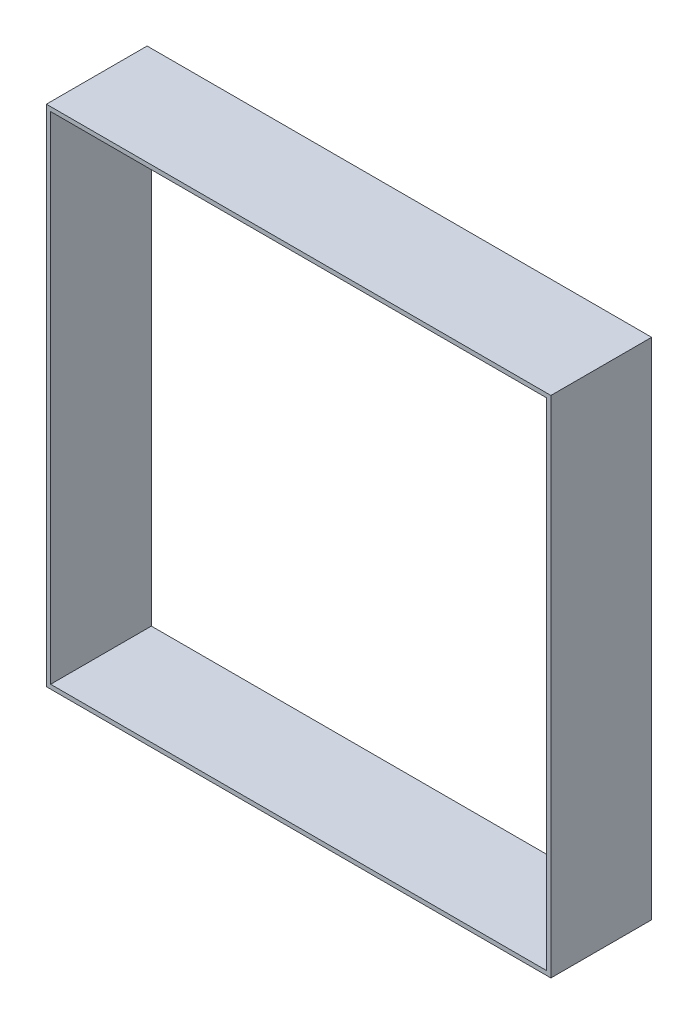
ISO-10303-21;
HEADER;
FILE_DESCRIPTION(('STEP AP214'),'2;1');
FILE_NAME('part.step','',(''),(''),'','','');
FILE_SCHEMA(('AUTOMOTIVE_DESIGN { 1 0 10303 214 1 1 1 1 }'));
ENDSEC;
DATA;
#1=APPLICATION_CONTEXT('core data for automotive mechanical design processes');
#2=APPLICATION_PROTOCOL_DEFINITION('international standard','automotive_design',2000,#1);
#3=PRODUCT_CONTEXT('',#1,'mechanical');
#4=PRODUCT('Part','Part','',(#3));
#5=PRODUCT_RELATED_PRODUCT_CATEGORY('part','',(#4));
#6=PRODUCT_DEFINITION_FORMATION('','',#4);
#7=PRODUCT_DEFINITION_CONTEXT('part definition',#1,'design');
#8=PRODUCT_DEFINITION('design','',#6,#7);
#9=PRODUCT_DEFINITION_SHAPE('','',#8);
#10=(LENGTH_UNIT() NAMED_UNIT(*) SI_UNIT(.MILLI.,.METRE.));
#11=(NAMED_UNIT(*) PLANE_ANGLE_UNIT() SI_UNIT($,.RADIAN.));
#12=(NAMED_UNIT(*) SI_UNIT($,.STERADIAN.) SOLID_ANGLE_UNIT());
#13=UNCERTAINTY_MEASURE_WITH_UNIT(LENGTH_MEASURE(1.E-05),#10,'distance_accuracy_value','');
#14=(GEOMETRIC_REPRESENTATION_CONTEXT(3) GLOBAL_UNCERTAINTY_ASSIGNED_CONTEXT((#13)) GLOBAL_UNIT_ASSIGNED_CONTEXT((#10,
#11,#12)) REPRESENTATION_CONTEXT('',''));
#15=CARTESIAN_POINT('',(0.,0.,0.));
#16=DIRECTION('',(0.,0.,1.));
#17=DIRECTION('',(1.,0.,0.));
#18=AXIS2_PLACEMENT_3D('',#15,#16,#17);
#19=CARTESIAN_POINT('',(0.,0.,130.));
#20=DIRECTION('',(0.,0.,-1.));
#21=DIRECTION('',(-1.,0.,0.));
#22=AXIS2_PLACEMENT_3D('',#19,#20,#21);
#23=PLANE('',#22);
#24=DIRECTION('',(0.,1.,0.));
#25=VECTOR('',#24,1.);
#26=CARTESIAN_POINT('',(325.5,-325.5,130.));
#27=LINE('',#26,#25);
#28=CARTESIAN_POINT('',(325.5,-325.5,130.));
#29=VERTEX_POINT('',#28);
#30=CARTESIAN_POINT('',(325.5,325.5,130.));
#31=VERTEX_POINT('',#30);
#32=EDGE_CURVE('E144',#29,#31,#27,.T.);
#33=ORIENTED_EDGE('',*,*,#32,.T.);
#34=DIRECTION('',(-1.,0.,0.));
#35=VECTOR('',#34,1.);
#36=CARTESIAN_POINT('',(-325.5,325.5,130.));
#37=LINE('',#36,#35);
#38=CARTESIAN_POINT('',(-325.5,325.5,130.));
#39=VERTEX_POINT('',#38);
#40=EDGE_CURVE('E147',#31,#39,#37,.T.);
#41=ORIENTED_EDGE('',*,*,#40,.T.);
#42=DIRECTION('',(0.,-1.,0.));
#43=VECTOR('',#42,1.);
#44=CARTESIAN_POINT('',(-325.5,-325.5,130.));
#45=LINE('',#44,#43);
#46=CARTESIAN_POINT('',(-325.5,-325.5,130.));
#47=VERTEX_POINT('',#46);
#48=EDGE_CURVE('E150',#39,#47,#45,.T.);
#49=ORIENTED_EDGE('',*,*,#48,.T.);
#50=DIRECTION('',(1.,0.,0.));
#51=VECTOR('',#50,1.);
#52=CARTESIAN_POINT('',(-325.5,-325.5,130.));
#53=LINE('',#52,#51);
#54=EDGE_CURVE('E152',#47,#29,#53,.T.);
#55=ORIENTED_EDGE('',*,*,#54,.T.);
#56=EDGE_LOOP('',(#33,#41,#49,#55));
#57=FACE_BOUND('',#56,.T.);
#58=DIRECTION('',(0.,1.,0.));
#59=VECTOR('',#58,1.);
#60=CARTESIAN_POINT('',(320.,-320.,130.));
#61=LINE('',#60,#59);
#62=CARTESIAN_POINT('',(320.,-320.,130.));
#63=VERTEX_POINT('',#62);
#64=CARTESIAN_POINT('',(320.,320.,130.));
#65=VERTEX_POINT('',#64);
#66=EDGE_CURVE('E108',#63,#65,#61,.T.);
#67=ORIENTED_EDGE('',*,*,#66,.F.);
#68=DIRECTION('',(1.,0.,0.));
#69=VECTOR('',#68,1.);
#70=CARTESIAN_POINT('',(-320.,-320.,130.));
#71=LINE('',#70,#69);
#72=CARTESIAN_POINT('',(-320.,-320.,130.));
#73=VERTEX_POINT('',#72);
#74=EDGE_CURVE('E130',#73,#63,#71,.T.);
#75=ORIENTED_EDGE('',*,*,#74,.F.);
#76=DIRECTION('',(0.,-1.,0.));
#77=VECTOR('',#76,1.);
#78=CARTESIAN_POINT('',(-320.,-320.,130.));
#79=LINE('',#78,#77);
#80=CARTESIAN_POINT('',(-320.,320.,130.));
#81=VERTEX_POINT('',#80);
#82=EDGE_CURVE('E128',#81,#73,#79,.T.);
#83=ORIENTED_EDGE('',*,*,#82,.F.);
#84=DIRECTION('',(-1.,0.,0.));
#85=VECTOR('',#84,1.);
#86=CARTESIAN_POINT('',(-320.,320.,130.));
#87=LINE('',#86,#85);
#88=EDGE_CURVE('E116',#65,#81,#87,.T.);
#89=ORIENTED_EDGE('',*,*,#88,.F.);
#90=EDGE_LOOP('',(#67,#75,#83,#89));
#91=FACE_BOUND('',#90,.T.);
#92=ADVANCED_FACE('F43',(#57,#91),#23,.F.);
#93=CARTESIAN_POINT('',(0.,0.,0.));
#94=DIRECTION('',(0.,0.,-1.));
#95=DIRECTION('',(-1.,0.,0.));
#96=AXIS2_PLACEMENT_3D('',#93,#94,#95);
#97=PLANE('',#96);
#98=DIRECTION('',(0.,1.,0.));
#99=VECTOR('',#98,1.);
#100=CARTESIAN_POINT('',(325.5,-325.5,0.));
#101=LINE('',#100,#99);
#102=CARTESIAN_POINT('',(325.5,-325.5,0.));
#103=VERTEX_POINT('',#102);
#104=CARTESIAN_POINT('',(325.5,325.5,0.));
#105=VERTEX_POINT('',#104);
#106=EDGE_CURVE('E124',#103,#105,#101,.T.);
#107=ORIENTED_EDGE('',*,*,#106,.F.);
#108=DIRECTION('',(1.,0.,0.));
#109=VECTOR('',#108,1.);
#110=CARTESIAN_POINT('',(-325.5,-325.5,0.));
#111=LINE('',#110,#109);
#112=CARTESIAN_POINT('',(-325.5,-325.5,0.));
#113=VERTEX_POINT('',#112);
#114=EDGE_CURVE('E148',#113,#103,#111,.T.);
#115=ORIENTED_EDGE('',*,*,#114,.F.);
#116=DIRECTION('',(0.,-1.,0.));
#117=VECTOR('',#116,1.);
#118=CARTESIAN_POINT('',(-325.5,-325.5,0.));
#119=LINE('',#118,#117);
#120=CARTESIAN_POINT('',(-325.5,325.5,0.));
#121=VERTEX_POINT('',#120);
#122=EDGE_CURVE('E159',#121,#113,#119,.T.);
#123=ORIENTED_EDGE('',*,*,#122,.F.);
#124=DIRECTION('',(-1.,0.,0.));
#125=VECTOR('',#124,1.);
#126=CARTESIAN_POINT('',(-325.5,325.5,0.));
#127=LINE('',#126,#125);
#128=EDGE_CURVE('E157',#105,#121,#127,.T.);
#129=ORIENTED_EDGE('',*,*,#128,.F.);
#130=EDGE_LOOP('',(#107,#115,#123,#129));
#131=FACE_BOUND('',#130,.T.);
#132=DIRECTION('',(1.,0.,0.));
#133=VECTOR('',#132,1.);
#134=CARTESIAN_POINT('',(-320.,-320.,0.));
#135=LINE('',#134,#133);
#136=CARTESIAN_POINT('',(-320.,-320.,0.));
#137=VERTEX_POINT('',#136);
#138=CARTESIAN_POINT('',(320.,-320.,0.));
#139=VERTEX_POINT('',#138);
#140=EDGE_CURVE('E117',#137,#139,#135,.T.);
#141=ORIENTED_EDGE('',*,*,#140,.T.);
#142=DIRECTION('',(0.,1.,0.));
#143=VECTOR('',#142,1.);
#144=CARTESIAN_POINT('',(320.,-320.,0.));
#145=LINE('',#144,#143);
#146=CARTESIAN_POINT('',(320.,320.,0.));
#147=VERTEX_POINT('',#146);
#148=EDGE_CURVE('E66',#139,#147,#145,.T.);
#149=ORIENTED_EDGE('',*,*,#148,.T.);
#150=DIRECTION('',(-1.,0.,0.));
#151=VECTOR('',#150,1.);
#152=CARTESIAN_POINT('',(-320.,320.,0.));
#153=LINE('',#152,#151);
#154=CARTESIAN_POINT('',(-320.,320.,0.));
#155=VERTEX_POINT('',#154);
#156=EDGE_CURVE('E123',#147,#155,#153,.T.);
#157=ORIENTED_EDGE('',*,*,#156,.T.);
#158=DIRECTION('',(0.,-1.,0.));
#159=VECTOR('',#158,1.);
#160=CARTESIAN_POINT('',(-320.,-320.,0.));
#161=LINE('',#160,#159);
#162=EDGE_CURVE('E136',#155,#137,#161,.T.);
#163=ORIENTED_EDGE('',*,*,#162,.T.);
#164=EDGE_LOOP('',(#141,#149,#157,#163));
#165=FACE_BOUND('',#164,.T.);
#166=ADVANCED_FACE('F177',(#131,#165),#97,.T.);
#167=CARTESIAN_POINT('',(325.5,-325.5,130.));
#168=DIRECTION('',(-1.,0.,0.));
#169=DIRECTION('',(0.,0.,1.));
#170=AXIS2_PLACEMENT_3D('',#167,#168,#169);
#171=PLANE('',#170);
#172=ORIENTED_EDGE('',*,*,#106,.T.);
#173=DIRECTION('',(0.,0.,-1.));
#174=VECTOR('',#173,1.);
#175=CARTESIAN_POINT('',(325.5,325.5,130.));
#176=LINE('',#175,#174);
#177=EDGE_CURVE('E11',#31,#105,#176,.T.);
#178=ORIENTED_EDGE('',*,*,#177,.F.);
#179=ORIENTED_EDGE('',*,*,#32,.F.);
#180=DIRECTION('',(0.,0.,-1.));
#181=VECTOR('',#180,1.);
#182=CARTESIAN_POINT('',(325.5,-325.5,130.));
#183=LINE('',#182,#181);
#184=EDGE_CURVE('E154',#29,#103,#183,.T.);
#185=ORIENTED_EDGE('',*,*,#184,.T.);
#186=EDGE_LOOP('',(#172,#178,#179,#185));
#187=FACE_BOUND('',#186,.T.);
#188=ADVANCED_FACE('F45',(#187),#171,.F.);
#189=CARTESIAN_POINT('',(-325.5,325.5,130.));
#190=DIRECTION('',(0.,-1.,0.));
#191=DIRECTION('',(0.,0.,-1.));
#192=AXIS2_PLACEMENT_3D('',#189,#190,#191);
#193=PLANE('',#192);
#194=ORIENTED_EDGE('',*,*,#128,.T.);
#195=DIRECTION('',(0.,0.,-1.));
#196=VECTOR('',#195,1.);
#197=CARTESIAN_POINT('',(-325.5,325.5,130.));
#198=LINE('',#197,#196);
#199=EDGE_CURVE('E51',#39,#121,#198,.T.);
#200=ORIENTED_EDGE('',*,*,#199,.F.);
#201=ORIENTED_EDGE('',*,*,#40,.F.);
#202=ORIENTED_EDGE('',*,*,#177,.T.);
#203=EDGE_LOOP('',(#194,#200,#201,#202));
#204=FACE_BOUND('',#203,.T.);
#205=ADVANCED_FACE('F187',(#204),#193,.F.);
#206=CARTESIAN_POINT('',(-325.5,-325.5,130.));
#207=DIRECTION('',(1.,0.,0.));
#208=DIRECTION('',(0.,0.,-1.));
#209=AXIS2_PLACEMENT_3D('',#206,#207,#208);
#210=PLANE('',#209);
#211=ORIENTED_EDGE('',*,*,#122,.T.);
#212=DIRECTION('',(0.,0.,-1.));
#213=VECTOR('',#212,1.);
#214=CARTESIAN_POINT('',(-325.5,-325.5,130.));
#215=LINE('',#214,#213);
#216=EDGE_CURVE('E164',#47,#113,#215,.T.);
#217=ORIENTED_EDGE('',*,*,#216,.F.);
#218=ORIENTED_EDGE('',*,*,#48,.F.);
#219=ORIENTED_EDGE('',*,*,#199,.T.);
#220=EDGE_LOOP('',(#211,#217,#218,#219));
#221=FACE_BOUND('',#220,.T.);
#222=ADVANCED_FACE('F171',(#221),#210,.F.);
#223=CARTESIAN_POINT('',(-325.5,-325.5,130.));
#224=DIRECTION('',(0.,1.,0.));
#225=DIRECTION('',(0.,0.,1.));
#226=AXIS2_PLACEMENT_3D('',#223,#224,#225);
#227=PLANE('',#226);
#228=ORIENTED_EDGE('',*,*,#114,.T.);
#229=ORIENTED_EDGE('',*,*,#184,.F.);
#230=ORIENTED_EDGE('',*,*,#54,.F.);
#231=ORIENTED_EDGE('',*,*,#216,.T.);
#232=EDGE_LOOP('',(#228,#229,#230,#231));
#233=FACE_BOUND('',#232,.T.);
#234=ADVANCED_FACE('F181',(#233),#227,.F.);
#235=CARTESIAN_POINT('',(320.,-320.,130.));
#236=DIRECTION('',(-1.,0.,0.));
#237=DIRECTION('',(0.,0.,1.));
#238=AXIS2_PLACEMENT_3D('',#235,#236,#237);
#239=PLANE('',#238);
#240=ORIENTED_EDGE('',*,*,#148,.F.);
#241=DIRECTION('',(0.,0.,-1.));
#242=VECTOR('',#241,1.);
#243=CARTESIAN_POINT('',(320.,-320.,130.));
#244=LINE('',#243,#242);
#245=EDGE_CURVE('E112',#63,#139,#244,.T.);
#246=ORIENTED_EDGE('',*,*,#245,.F.);
#247=ORIENTED_EDGE('',*,*,#66,.T.);
#248=DIRECTION('',(0.,0.,-1.));
#249=VECTOR('',#248,1.);
#250=CARTESIAN_POINT('',(320.,320.,130.));
#251=LINE('',#250,#249);
#252=EDGE_CURVE('E111',#65,#147,#251,.T.);
#253=ORIENTED_EDGE('',*,*,#252,.T.);
#254=EDGE_LOOP('',(#240,#246,#247,#253));
#255=FACE_BOUND('',#254,.T.);
#256=ADVANCED_FACE('F110',(#255),#239,.T.);
#257=CARTESIAN_POINT('',(-320.,320.,130.));
#258=DIRECTION('',(0.,-1.,0.));
#259=DIRECTION('',(0.,0.,-1.));
#260=AXIS2_PLACEMENT_3D('',#257,#258,#259);
#261=PLANE('',#260);
#262=ORIENTED_EDGE('',*,*,#156,.F.);
#263=ORIENTED_EDGE('',*,*,#252,.F.);
#264=ORIENTED_EDGE('',*,*,#88,.T.);
#265=DIRECTION('',(0.,0.,-1.));
#266=VECTOR('',#265,1.);
#267=CARTESIAN_POINT('',(-320.,320.,130.));
#268=LINE('',#267,#266);
#269=EDGE_CURVE('E125',#81,#155,#268,.T.);
#270=ORIENTED_EDGE('',*,*,#269,.T.);
#271=EDGE_LOOP('',(#262,#263,#264,#270));
#272=FACE_BOUND('',#271,.T.);
#273=ADVANCED_FACE('F120',(#272),#261,.T.);
#274=CARTESIAN_POINT('',(-320.,-320.,130.));
#275=DIRECTION('',(1.,0.,0.));
#276=DIRECTION('',(0.,0.,-1.));
#277=AXIS2_PLACEMENT_3D('',#274,#275,#276);
#278=PLANE('',#277);
#279=ORIENTED_EDGE('',*,*,#162,.F.);
#280=ORIENTED_EDGE('',*,*,#269,.F.);
#281=ORIENTED_EDGE('',*,*,#82,.T.);
#282=DIRECTION('',(0.,0.,-1.));
#283=VECTOR('',#282,1.);
#284=CARTESIAN_POINT('',(-320.,-320.,130.));
#285=LINE('',#284,#283);
#286=EDGE_CURVE('E58',#73,#137,#285,.T.);
#287=ORIENTED_EDGE('',*,*,#286,.T.);
#288=EDGE_LOOP('',(#279,#280,#281,#287));
#289=FACE_BOUND('',#288,.T.);
#290=ADVANCED_FACE('F210',(#289),#278,.T.);
#291=CARTESIAN_POINT('',(-320.,-320.,130.));
#292=DIRECTION('',(0.,1.,0.));
#293=DIRECTION('',(-1.,0.,0.));
#294=AXIS2_PLACEMENT_3D('',#291,#292,#293);
#295=PLANE('',#294);
#296=ORIENTED_EDGE('',*,*,#140,.F.);
#297=ORIENTED_EDGE('',*,*,#286,.F.);
#298=ORIENTED_EDGE('',*,*,#74,.T.);
#299=ORIENTED_EDGE('',*,*,#245,.T.);
#300=EDGE_LOOP('',(#296,#297,#298,#299));
#301=FACE_BOUND('',#300,.T.);
#302=ADVANCED_FACE('F214',(#301),#295,.T.);
#303=CLOSED_SHELL('',(#92,#166,#188,#205,#222,#234,#256,#273,#290,#302));
#304=MANIFOLD_SOLID_BREP('B2',#303);
#305=ADVANCED_BREP_SHAPE_REPRESENTATION('',(#18,#304),#14);
#306=SHAPE_DEFINITION_REPRESENTATION(#9,#305);
ENDSEC;
END-ISO-10303-21;
